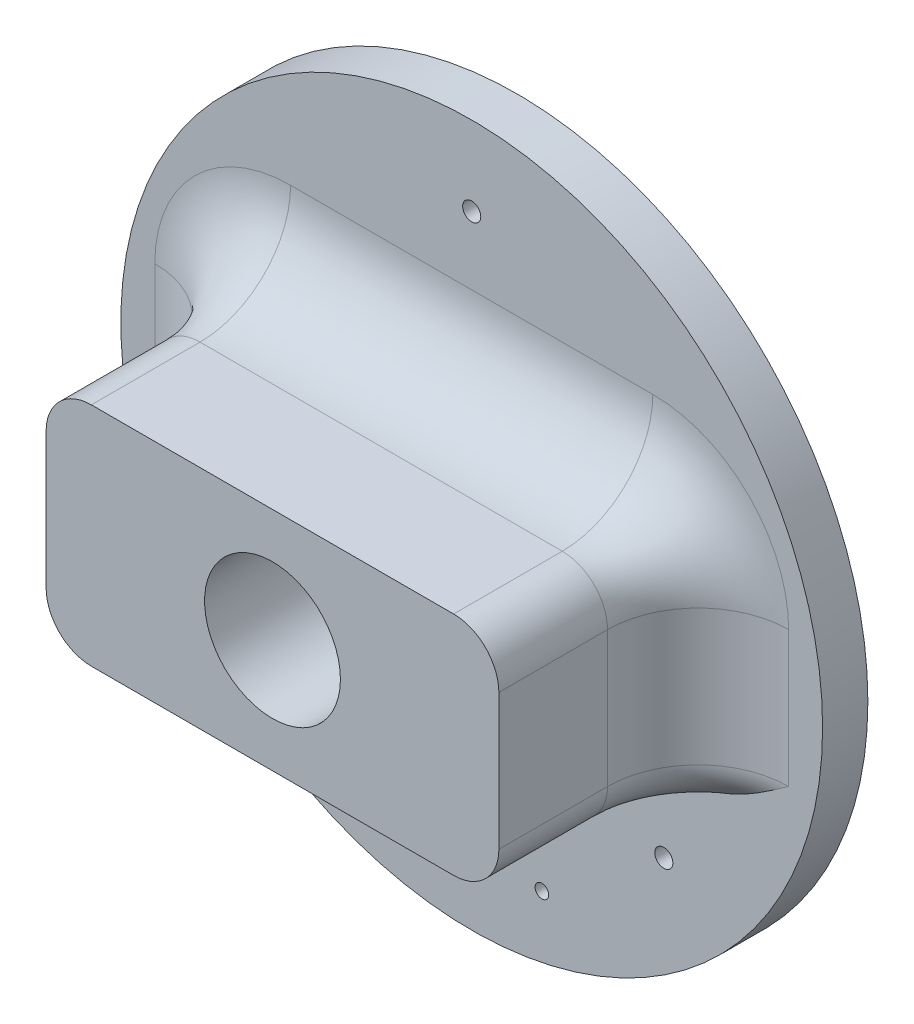
ISO-10303-21;
HEADER;
FILE_DESCRIPTION(('STEP AP214'),'2;1');
FILE_NAME('part.step','',(''),(''),'','','');
FILE_SCHEMA(('AUTOMOTIVE_DESIGN { 1 0 10303 214 1 1 1 1 }'));
ENDSEC;
DATA;
#1=APPLICATION_CONTEXT('core data for automotive mechanical design processes');
#2=APPLICATION_PROTOCOL_DEFINITION('international standard','automotive_design',2000,#1);
#3=PRODUCT_CONTEXT('',#1,'mechanical');
#4=PRODUCT('Part','Part','',(#3));
#5=PRODUCT_RELATED_PRODUCT_CATEGORY('part','',(#4));
#6=PRODUCT_DEFINITION_FORMATION('','',#4);
#7=PRODUCT_DEFINITION_CONTEXT('part definition',#1,'design');
#8=PRODUCT_DEFINITION('design','',#6,#7);
#9=PRODUCT_DEFINITION_SHAPE('','',#8);
#10=(LENGTH_UNIT() NAMED_UNIT(*) SI_UNIT(.MILLI.,.METRE.));
#11=(NAMED_UNIT(*) PLANE_ANGLE_UNIT() SI_UNIT($,.RADIAN.));
#12=(NAMED_UNIT(*) SI_UNIT($,.STERADIAN.) SOLID_ANGLE_UNIT());
#13=UNCERTAINTY_MEASURE_WITH_UNIT(LENGTH_MEASURE(1.E-05),#10,'distance_accuracy_value','');
#14=(GEOMETRIC_REPRESENTATION_CONTEXT(3) GLOBAL_UNCERTAINTY_ASSIGNED_CONTEXT((#13)) GLOBAL_UNIT_ASSIGNED_CONTEXT((#10,
#11,#12)) REPRESENTATION_CONTEXT('',''));
#15=CARTESIAN_POINT('',(0.,0.,0.));
#16=DIRECTION('',(0.,0.,1.));
#17=DIRECTION('',(1.,0.,0.));
#18=AXIS2_PLACEMENT_3D('',#15,#16,#17);
#19=CARTESIAN_POINT('',(0.,0.,10.));
#20=DIRECTION('',(0.,0.,1.));
#21=DIRECTION('',(1.,0.,0.));
#22=AXIS2_PLACEMENT_3D('',#19,#20,#21);
#23=PLANE('',#22);
#24=CARTESIAN_POINT('',(-42.4264068711926,-42.4264068711931,10.));
#25=DIRECTION('',(0.,0.,1.));
#26=DIRECTION('',(1.,0.,0.));
#27=AXIS2_PLACEMENT_3D('',#24,#25,#26);
#28=CIRCLE('',#27,2.);
#29=CARTESIAN_POINT('',(-40.4264068711926,-42.4264068711931,10.));
#30=VERTEX_POINT('',#29);
#31=EDGE_CURVE('E273',#30,#30,#28,.T.);
#32=ORIENTED_EDGE('',*,*,#31,.F.);
#33=EDGE_LOOP('',(#32));
#34=FACE_BOUND('',#33,.T.);
#35=CARTESIAN_POINT('',(15.4997806436091,-31.2502193563909,10.));
#36=DIRECTION('',(0.,0.,1.));
#37=DIRECTION('',(1.,0.,0.));
#38=AXIS2_PLACEMENT_3D('',#35,#36,#37);
#39=CIRCLE('',#38,1.5);
#40=CARTESIAN_POINT('',(16.9997806436091,-31.2502193563909,10.));
#41=VERTEX_POINT('',#40);
#42=EDGE_CURVE('E277',#41,#41,#39,.T.);
#43=ORIENTED_EDGE('',*,*,#42,.F.);
#44=EDGE_LOOP('',(#43));
#45=FACE_BOUND('',#44,.T.);
#46=CARTESIAN_POINT('',(15.4997806436092,-62.2497806436091,10.));
#47=DIRECTION('',(0.,0.,1.));
#48=DIRECTION('',(1.,0.,0.));
#49=AXIS2_PLACEMENT_3D('',#46,#47,#48);
#50=CIRCLE('',#49,1.5);
#51=CARTESIAN_POINT('',(16.9997806436092,-62.2497806436091,10.));
#52=VERTEX_POINT('',#51);
#53=EDGE_CURVE('E281',#52,#52,#50,.T.);
#54=ORIENTED_EDGE('',*,*,#53,.F.);
#55=EDGE_LOOP('',(#54));
#56=FACE_BOUND('',#55,.T.);
#57=CARTESIAN_POINT('',(-15.4997806436091,-62.2497806436091,10.));
#58=DIRECTION('',(0.,0.,1.));
#59=DIRECTION('',(1.,0.,0.));
#60=AXIS2_PLACEMENT_3D('',#57,#58,#59);
#61=CIRCLE('',#60,1.5);
#62=CARTESIAN_POINT('',(-13.9997806436091,-62.2497806436091,10.));
#63=VERTEX_POINT('',#62);
#64=EDGE_CURVE('E285',#63,#63,#61,.T.);
#65=ORIENTED_EDGE('',*,*,#64,.F.);
#66=EDGE_LOOP('',(#65));
#67=FACE_BOUND('',#66,.T.);
#68=CARTESIAN_POINT('',(0.,60.,10.));
#69=DIRECTION('',(0.,0.,1.));
#70=DIRECTION('',(1.,0.,0.));
#71=AXIS2_PLACEMENT_3D('',#68,#69,#70);
#72=CIRCLE('',#71,2.);
#73=CARTESIAN_POINT('',(1.99999999999995,60.,10.));
#74=VERTEX_POINT('',#73);
#75=EDGE_CURVE('E289',#74,#74,#72,.T.);
#76=ORIENTED_EDGE('',*,*,#75,.F.);
#77=EDGE_LOOP('',(#76));
#78=FACE_BOUND('',#77,.T.);
#79=CARTESIAN_POINT('',(42.4264068711927,-42.426406871193,10.));
#80=DIRECTION('',(0.,0.,1.));
#81=DIRECTION('',(1.,0.,0.));
#82=AXIS2_PLACEMENT_3D('',#79,#80,#81);
#83=CIRCLE('',#82,2.);
#84=CARTESIAN_POINT('',(44.4264068711927,-42.426406871193,10.));
#85=VERTEX_POINT('',#84);
#86=EDGE_CURVE('E293',#85,#85,#83,.T.);
#87=ORIENTED_EDGE('',*,*,#86,.F.);
#88=EDGE_LOOP('',(#87));
#89=FACE_BOUND('',#88,.T.);
#90=CARTESIAN_POINT('',(-15.4997806436092,-31.2502193563909,10.));
#91=DIRECTION('',(0.,0.,1.));
#92=DIRECTION('',(1.,0.,0.));
#93=AXIS2_PLACEMENT_3D('',#90,#91,#92);
#94=CIRCLE('',#93,1.50000000000003);
#95=CARTESIAN_POINT('',(-13.9997806436091,-31.2502193563909,10.));
#96=VERTEX_POINT('',#95);
#97=EDGE_CURVE('E297',#96,#96,#94,.T.);
#98=ORIENTED_EDGE('',*,*,#97,.F.);
#99=EDGE_LOOP('',(#98));
#100=FACE_BOUND('',#99,.T.);
#101=CARTESIAN_POINT('',(0.,0.,10.));
#102=DIRECTION('',(0.,0.,1.));
#103=DIRECTION('',(1.,0.,0.));
#104=AXIS2_PLACEMENT_3D('',#101,#102,#103);
#105=CIRCLE('',#104,77.5);
#106=CARTESIAN_POINT('',(77.5,0.,10.));
#107=VERTEX_POINT('',#106);
#108=EDGE_CURVE('E161',#107,#107,#105,.T.);
#109=ORIENTED_EDGE('',*,*,#108,.T.);
#110=EDGE_LOOP('',(#109));
#111=FACE_BOUND('',#110,.T.);
#112=CARTESIAN_POINT('',(-40.,15.,10.));
#113=DIRECTION('',(0.,0.,1.));
#114=DIRECTION('',(1.,0.,0.));
#115=AXIS2_PLACEMENT_3D('',#112,#113,#114);
#116=CIRCLE('',#115,30.);
#117=CARTESIAN_POINT('',(-40.,45.,10.));
#118=VERTEX_POINT('',#117);
#119=CARTESIAN_POINT('',(-70.,15.,10.));
#120=VERTEX_POINT('',#119);
#121=EDGE_CURVE('E45',#118,#120,#116,.T.);
#122=ORIENTED_EDGE('',*,*,#121,.F.);
#123=DIRECTION('',(-1.,0.,0.));
#124=VECTOR('',#123,1.);
#125=CARTESIAN_POINT('',(0.,45.,10.));
#126=LINE('',#125,#124);
#127=CARTESIAN_POINT('',(40.,45.,10.));
#128=VERTEX_POINT('',#127);
#129=EDGE_CURVE('E56',#118,#128,#126,.F.);
#130=ORIENTED_EDGE('',*,*,#129,.T.);
#131=CARTESIAN_POINT('',(40.,15.,10.));
#132=DIRECTION('',(0.,0.,1.));
#133=DIRECTION('',(1.,0.,0.));
#134=AXIS2_PLACEMENT_3D('',#131,#132,#133);
#135=CIRCLE('',#134,30.);
#136=CARTESIAN_POINT('',(70.,15.,10.));
#137=VERTEX_POINT('',#136);
#138=EDGE_CURVE('E132',#137,#128,#135,.T.);
#139=ORIENTED_EDGE('',*,*,#138,.F.);
#140=DIRECTION('',(0.,1.,0.));
#141=VECTOR('',#140,1.);
#142=CARTESIAN_POINT('',(70.,0.,10.));
#143=LINE('',#142,#141);
#144=CARTESIAN_POINT('',(70.,-15.,10.));
#145=VERTEX_POINT('',#144);
#146=EDGE_CURVE('E170',#137,#145,#143,.F.);
#147=ORIENTED_EDGE('',*,*,#146,.T.);
#148=CARTESIAN_POINT('',(47.6393202250021,-25.,10.));
#149=CARTESIAN_POINT('',(48.2331981965471,-24.9999673669586,10.));
#150=CARTESIAN_POINT('',(48.8264945480019,-24.970628009673,10.));
#151=CARTESIAN_POINT('',(50.0070536097781,-24.8595567923696,10.));
#152=CARTESIAN_POINT('',(50.5943259954527,-24.7779295660576,10.));
#153=CARTESIAN_POINT('',(51.750773053257,-24.5701777949689,10.));
#154=CARTESIAN_POINT('',(52.3200865115616,-24.4448074673556,10.));
#155=CARTESIAN_POINT('',(53.4487804276685,-24.1547169869959,10.));
#156=CARTESIAN_POINT('',(54.00815513936,-23.9899748187703,10.));
#157=CARTESIAN_POINT('',(55.7738877139314,-23.4100113970212,10.));
#158=CARTESIAN_POINT('',(56.9591729878578,-22.929774002456,10.));
#159=CARTESIAN_POINT('',(58.6951035109056,-22.1216962848325,10.));
#160=CARTESIAN_POINT('',(59.2672366240675,-21.8374253564783,10.));
#161=CARTESIAN_POINT('',(60.3987394378906,-21.2444542369346,10.));
#162=CARTESIAN_POINT('',(60.9581103395032,-20.9357563566905,10.));
#163=CARTESIAN_POINT('',(62.6288832158347,-19.9743938950044,10.));
#164=CARTESIAN_POINT('',(63.7227184872843,-19.2914070073752,10.));
#165=CARTESIAN_POINT('',(65.8784951602568,-17.8790655487652,9.99999999999999));
#166=CARTESIAN_POINT('',(66.9404507074271,-17.1497320042067,9.99999999999998));
#167=CARTESIAN_POINT('',(68.6580603080296,-15.9488306330498,10.));
#168=CARTESIAN_POINT('',(69.3174964157375,-15.482602173977,10.));
#169=CARTESIAN_POINT('',(69.9846039925874,-15.0108866216073,10.));
#170=CARTESIAN_POINT('',(69.9923019961747,-15.0054433110716,10.));
#171=CARTESIAN_POINT('',(70.,-15.,10.));
#172=B_SPLINE_CURVE_WITH_KNOTS('',3,(#148,#149,#150,#151,#152,#153,#154,#155,#156,#157,#158,
#159,#160,#161,#162,#163,#164,#165,#166,#167,#168,#169,#170,#171),.UNSPECIFIED.,.F.,.F.,(4,2,2,
2,2,2,2,2,2,2,2,4),(0.,1.78007201554144,3.55659299449519,5.30388464058156,7.05215561193782,
10.877932207877,12.7942256891187,14.7103380930205,18.5765462026327,22.4410126539084,
24.8638369819083,24.8921212531558),.UNSPECIFIED.);
#173=CARTESIAN_POINT('',(47.6393202250021,-25.,10.));
#174=VERTEX_POINT('',#173);
#175=EDGE_CURVE('E133',#145,#174,#172,.F.);
#176=ORIENTED_EDGE('',*,*,#175,.T.);
#177=DIRECTION('',(1.,0.,0.));
#178=VECTOR('',#177,1.);
#179=CARTESIAN_POINT('',(-50.,-25.,10.));
#180=LINE('',#179,#178);
#181=CARTESIAN_POINT('',(-47.6393202250021,-25.,10.));
#182=VERTEX_POINT('',#181);
#183=EDGE_CURVE('E139',#182,#174,#180,.T.);
#184=ORIENTED_EDGE('',*,*,#183,.F.);
#185=CARTESIAN_POINT('',(-47.6393202250021,-25.,10.));
#186=CARTESIAN_POINT('',(-48.2331981965471,-24.9999673669586,10.));
#187=CARTESIAN_POINT('',(-48.8264945480019,-24.970628009673,10.));
#188=CARTESIAN_POINT('',(-50.0070536097781,-24.8595567923696,10.));
#189=CARTESIAN_POINT('',(-50.5943259954527,-24.7779295660576,10.));
#190=CARTESIAN_POINT('',(-51.750773053257,-24.5701777949689,10.));
#191=CARTESIAN_POINT('',(-52.3200865115616,-24.4448074673556,10.));
#192=CARTESIAN_POINT('',(-53.4487804276685,-24.1547169869959,10.));
#193=CARTESIAN_POINT('',(-54.00815513936,-23.9899748187703,10.));
#194=CARTESIAN_POINT('',(-55.7738877139314,-23.4100113970212,10.));
#195=CARTESIAN_POINT('',(-56.9591729878578,-22.929774002456,10.));
#196=CARTESIAN_POINT('',(-58.6951035109056,-22.1216962848325,10.));
#197=CARTESIAN_POINT('',(-59.2672366240675,-21.8374253564783,10.));
#198=CARTESIAN_POINT('',(-60.3987394378906,-21.2444542369346,10.));
#199=CARTESIAN_POINT('',(-60.9581103395032,-20.9357563566905,10.));
#200=CARTESIAN_POINT('',(-62.6288832158347,-19.9743938950044,10.));
#201=CARTESIAN_POINT('',(-63.7227184872843,-19.2914070073752,10.));
#202=CARTESIAN_POINT('',(-65.8784951602568,-17.8790655487652,9.99999999999999));
#203=CARTESIAN_POINT('',(-66.9404507074271,-17.1497320042067,9.99999999999998));
#204=CARTESIAN_POINT('',(-68.6580603080296,-15.9488306330498,10.));
#205=CARTESIAN_POINT('',(-69.3174964157375,-15.482602173977,10.));
#206=CARTESIAN_POINT('',(-69.9846039925874,-15.0108866216073,10.));
#207=CARTESIAN_POINT('',(-69.9923019961747,-15.0054433110716,10.));
#208=CARTESIAN_POINT('',(-70.,-15.,10.));
#209=B_SPLINE_CURVE_WITH_KNOTS('',3,(#185,#186,#187,#188,#189,#190,#191,#192,#193,#194,#195,
#196,#197,#198,#199,#200,#201,#202,#203,#204,#205,#206,#207,#208),.UNSPECIFIED.,.F.,.F.,(4,2,2,
2,2,2,2,2,2,2,2,4),(0.,1.78007201554144,3.55659299449519,5.30388464058156,7.05215561193782,
10.877932207877,12.7942256891187,14.7103380930205,18.5765462026327,22.4410126539084,
24.8638369819083,24.8921212531558),.UNSPECIFIED.);
#210=CARTESIAN_POINT('',(-70.,-15.,10.));
#211=VERTEX_POINT('',#210);
#212=EDGE_CURVE('E124',#182,#211,#209,.T.);
#213=ORIENTED_EDGE('',*,*,#212,.T.);
#214=DIRECTION('',(0.,-1.,0.));
#215=VECTOR('',#214,1.);
#216=CARTESIAN_POINT('',(-70.,0.,10.));
#217=LINE('',#216,#215);
#218=EDGE_CURVE('E172',#211,#120,#217,.F.);
#219=ORIENTED_EDGE('',*,*,#218,.T.);
#220=EDGE_LOOP('',(#122,#130,#139,#147,#176,#184,#213,#219));
#221=FACE_BOUND('',#220,.T.);
#222=ADVANCED_FACE('F36',(#34,#45,#56,#67,#78,#89,#100,#111,#221),#23,.T.);
#223=CARTESIAN_POINT('',(0.,0.,10.));
#224=DIRECTION('',(0.,0.,-1.));
#225=DIRECTION('',(-1.,0.,0.));
#226=AXIS2_PLACEMENT_3D('',#223,#224,#225);
#227=CYLINDRICAL_SURFACE('',#226,77.5);
#228=ORIENTED_EDGE('',*,*,#108,.F.);
#229=EDGE_LOOP('',(#228));
#230=FACE_BOUND('',#229,.T.);
#231=CARTESIAN_POINT('',(0.,0.,0.));
#232=DIRECTION('',(0.,0.,1.));
#233=DIRECTION('',(1.,0.,0.));
#234=AXIS2_PLACEMENT_3D('',#231,#232,#233);
#235=CIRCLE('',#234,77.5);
#236=CARTESIAN_POINT('',(77.5,0.,0.));
#237=VERTEX_POINT('',#236);
#238=EDGE_CURVE('E165',#237,#237,#235,.T.);
#239=ORIENTED_EDGE('',*,*,#238,.T.);
#240=EDGE_LOOP('',(#239));
#241=FACE_BOUND('',#240,.T.);
#242=ADVANCED_FACE('F262',(#230,#241),#227,.T.);
#243=CARTESIAN_POINT('',(0.,0.,0.));
#244=DIRECTION('',(0.,0.,1.));
#245=DIRECTION('',(1.,0.,0.));
#246=AXIS2_PLACEMENT_3D('',#243,#244,#245);
#247=PLANE('',#246);
#248=CARTESIAN_POINT('',(-42.4264068711926,-42.4264068711931,0.));
#249=DIRECTION('',(0.,0.,1.));
#250=DIRECTION('',(1.,0.,0.));
#251=AXIS2_PLACEMENT_3D('',#248,#249,#250);
#252=CIRCLE('',#251,2.);
#253=CARTESIAN_POINT('',(-40.4264068711926,-42.4264068711931,0.));
#254=VERTEX_POINT('',#253);
#255=EDGE_CURVE('E432',#254,#254,#252,.T.);
#256=ORIENTED_EDGE('',*,*,#255,.T.);
#257=EDGE_LOOP('',(#256));
#258=FACE_BOUND('',#257,.T.);
#259=CARTESIAN_POINT('',(15.4997806436091,-31.2502193563909,0.));
#260=DIRECTION('',(0.,0.,1.));
#261=DIRECTION('',(1.,0.,0.));
#262=AXIS2_PLACEMENT_3D('',#259,#260,#261);
#263=CIRCLE('',#262,1.5);
#264=CARTESIAN_POINT('',(16.9997806436091,-31.2502193563909,0.));
#265=VERTEX_POINT('',#264);
#266=EDGE_CURVE('E435',#265,#265,#263,.T.);
#267=ORIENTED_EDGE('',*,*,#266,.T.);
#268=EDGE_LOOP('',(#267));
#269=FACE_BOUND('',#268,.T.);
#270=CARTESIAN_POINT('',(15.4997806436092,-62.2497806436091,0.));
#271=DIRECTION('',(0.,0.,1.));
#272=DIRECTION('',(1.,0.,0.));
#273=AXIS2_PLACEMENT_3D('',#270,#271,#272);
#274=CIRCLE('',#273,1.5);
#275=CARTESIAN_POINT('',(16.9997806436092,-62.2497806436091,0.));
#276=VERTEX_POINT('',#275);
#277=EDGE_CURVE('E438',#276,#276,#274,.T.);
#278=ORIENTED_EDGE('',*,*,#277,.T.);
#279=EDGE_LOOP('',(#278));
#280=FACE_BOUND('',#279,.T.);
#281=CARTESIAN_POINT('',(-15.4997806436091,-62.2497806436091,0.));
#282=DIRECTION('',(0.,0.,1.));
#283=DIRECTION('',(1.,0.,0.));
#284=AXIS2_PLACEMENT_3D('',#281,#282,#283);
#285=CIRCLE('',#284,1.5);
#286=CARTESIAN_POINT('',(-13.9997806436091,-62.2497806436091,0.));
#287=VERTEX_POINT('',#286);
#288=EDGE_CURVE('E430',#287,#287,#285,.T.);
#289=ORIENTED_EDGE('',*,*,#288,.T.);
#290=EDGE_LOOP('',(#289));
#291=FACE_BOUND('',#290,.T.);
#292=CARTESIAN_POINT('',(0.,60.,0.));
#293=DIRECTION('',(0.,0.,1.));
#294=DIRECTION('',(1.,0.,0.));
#295=AXIS2_PLACEMENT_3D('',#292,#293,#294);
#296=CIRCLE('',#295,2.);
#297=CARTESIAN_POINT('',(1.99999999999995,60.,0.));
#298=VERTEX_POINT('',#297);
#299=EDGE_CURVE('E424',#298,#298,#296,.T.);
#300=ORIENTED_EDGE('',*,*,#299,.T.);
#301=EDGE_LOOP('',(#300));
#302=FACE_BOUND('',#301,.T.);
#303=CARTESIAN_POINT('',(42.4264068711927,-42.426406871193,0.));
#304=DIRECTION('',(0.,0.,1.));
#305=DIRECTION('',(1.,0.,0.));
#306=AXIS2_PLACEMENT_3D('',#303,#304,#305);
#307=CIRCLE('',#306,2.);
#308=CARTESIAN_POINT('',(44.4264068711927,-42.426406871193,0.));
#309=VERTEX_POINT('',#308);
#310=EDGE_CURVE('E420',#309,#309,#307,.T.);
#311=ORIENTED_EDGE('',*,*,#310,.T.);
#312=EDGE_LOOP('',(#311));
#313=FACE_BOUND('',#312,.T.);
#314=CARTESIAN_POINT('',(-15.4997806436092,-31.2502193563909,0.));
#315=DIRECTION('',(0.,0.,1.));
#316=DIRECTION('',(1.,0.,0.));
#317=AXIS2_PLACEMENT_3D('',#314,#315,#316);
#318=CIRCLE('',#317,1.50000000000003);
#319=CARTESIAN_POINT('',(-13.9997806436091,-31.2502193563909,0.));
#320=VERTEX_POINT('',#319);
#321=EDGE_CURVE('E434',#320,#320,#318,.T.);
#322=ORIENTED_EDGE('',*,*,#321,.T.);
#323=EDGE_LOOP('',(#322));
#324=FACE_BOUND('',#323,.T.);
#325=ORIENTED_EDGE('',*,*,#238,.F.);
#326=EDGE_LOOP('',(#325));
#327=FACE_BOUND('',#326,.T.);
#328=ADVANCED_FACE('F267',(#258,#269,#280,#291,#302,#313,#324,#327),#247,.F.);
#329=CARTESIAN_POINT('',(50.,-25.,54.));
#330=DIRECTION('',(-1.,0.,0.));
#331=DIRECTION('',(0.,0.,1.));
#332=AXIS2_PLACEMENT_3D('',#329,#330,#331);
#333=PLANE('',#332);
#334=DIRECTION('',(0.,1.,0.));
#335=VECTOR('',#334,1.);
#336=CARTESIAN_POINT('',(50.,-25.,54.));
#337=LINE('',#336,#335);
#338=CARTESIAN_POINT('',(50.,-15.,54.));
#339=VERTEX_POINT('',#338);
#340=CARTESIAN_POINT('',(50.,15.,54.));
#341=VERTEX_POINT('',#340);
#342=EDGE_CURVE('E149',#339,#341,#337,.T.);
#343=ORIENTED_EDGE('',*,*,#342,.F.);
#344=DIRECTION('',(0.,0.,-1.));
#345=VECTOR('',#344,1.);
#346=CARTESIAN_POINT('',(50.,-15.,54.));
#347=LINE('',#346,#345);
#348=CARTESIAN_POINT('',(50.,-15.,30.));
#349=VERTEX_POINT('',#348);
#350=EDGE_CURVE('E194',#339,#349,#347,.T.);
#351=ORIENTED_EDGE('',*,*,#350,.T.);
#352=DIRECTION('',(0.,1.,0.));
#353=VECTOR('',#352,1.);
#354=CARTESIAN_POINT('',(50.,-25.,30.));
#355=LINE('',#354,#353);
#356=CARTESIAN_POINT('',(50.,15.,30.));
#357=VERTEX_POINT('',#356);
#358=EDGE_CURVE('E174',#349,#357,#355,.T.);
#359=ORIENTED_EDGE('',*,*,#358,.T.);
#360=DIRECTION('',(0.,0.,-1.));
#361=VECTOR('',#360,1.);
#362=CARTESIAN_POINT('',(50.,15.,54.));
#363=LINE('',#362,#361);
#364=EDGE_CURVE('E192',#357,#341,#363,.F.);
#365=ORIENTED_EDGE('',*,*,#364,.T.);
#366=EDGE_LOOP('',(#343,#351,#359,#365));
#367=FACE_BOUND('',#366,.T.);
#368=ADVANCED_FACE('F303',(#367),#333,.F.);
#369=CARTESIAN_POINT('',(-50.,25.,54.));
#370=DIRECTION('',(0.,-1.,0.));
#371=DIRECTION('',(0.,0.,-1.));
#372=AXIS2_PLACEMENT_3D('',#369,#370,#371);
#373=PLANE('',#372);
#374=DIRECTION('',(0.,0.,-1.));
#375=VECTOR('',#374,1.);
#376=CARTESIAN_POINT('',(40.,25.,54.));
#377=LINE('',#376,#375);
#378=CARTESIAN_POINT('',(40.,25.,54.));
#379=VERTEX_POINT('',#378);
#380=CARTESIAN_POINT('',(40.,25.,30.));
#381=VERTEX_POINT('',#380);
#382=EDGE_CURVE('E187',#379,#381,#377,.T.);
#383=ORIENTED_EDGE('',*,*,#382,.T.);
#384=DIRECTION('',(-1.,0.,0.));
#385=VECTOR('',#384,1.);
#386=CARTESIAN_POINT('',(-50.,25.,30.));
#387=LINE('',#386,#385);
#388=CARTESIAN_POINT('',(-40.,25.,30.));
#389=VERTEX_POINT('',#388);
#390=EDGE_CURVE('E11',#381,#389,#387,.T.);
#391=ORIENTED_EDGE('',*,*,#390,.T.);
#392=DIRECTION('',(0.,0.,-1.));
#393=VECTOR('',#392,1.);
#394=CARTESIAN_POINT('',(-40.,25.,54.));
#395=LINE('',#394,#393);
#396=CARTESIAN_POINT('',(-40.,25.,54.));
#397=VERTEX_POINT('',#396);
#398=EDGE_CURVE('E185',#389,#397,#395,.F.);
#399=ORIENTED_EDGE('',*,*,#398,.T.);
#400=DIRECTION('',(-1.,0.,0.));
#401=VECTOR('',#400,1.);
#402=CARTESIAN_POINT('',(-50.,25.,54.));
#403=LINE('',#402,#401);
#404=EDGE_CURVE('E153',#379,#397,#403,.T.);
#405=ORIENTED_EDGE('',*,*,#404,.F.);
#406=EDGE_LOOP('',(#383,#391,#399,#405));
#407=FACE_BOUND('',#406,.T.);
#408=ADVANCED_FACE('F308',(#407),#373,.F.);
#409=CARTESIAN_POINT('',(-50.,-25.,54.));
#410=DIRECTION('',(1.,0.,0.));
#411=DIRECTION('',(0.,0.,-1.));
#412=AXIS2_PLACEMENT_3D('',#409,#410,#411);
#413=PLANE('',#412);
#414=DIRECTION('',(0.,-1.,0.));
#415=VECTOR('',#414,1.);
#416=CARTESIAN_POINT('',(-50.,-25.,54.));
#417=LINE('',#416,#415);
#418=CARTESIAN_POINT('',(-50.,15.,54.));
#419=VERTEX_POINT('',#418);
#420=CARTESIAN_POINT('',(-50.,-15.,54.));
#421=VERTEX_POINT('',#420);
#422=EDGE_CURVE('E349',#419,#421,#417,.T.);
#423=ORIENTED_EDGE('',*,*,#422,.F.);
#424=DIRECTION('',(0.,0.,-1.));
#425=VECTOR('',#424,1.);
#426=CARTESIAN_POINT('',(-50.,15.,54.));
#427=LINE('',#426,#425);
#428=CARTESIAN_POINT('',(-50.,15.,30.));
#429=VERTEX_POINT('',#428);
#430=EDGE_CURVE('E206',#419,#429,#427,.T.);
#431=ORIENTED_EDGE('',*,*,#430,.T.);
#432=DIRECTION('',(0.,-1.,0.));
#433=VECTOR('',#432,1.);
#434=CARTESIAN_POINT('',(-50.,-25.,30.));
#435=LINE('',#434,#433);
#436=CARTESIAN_POINT('',(-50.,-15.,30.));
#437=VERTEX_POINT('',#436);
#438=EDGE_CURVE('E164',#429,#437,#435,.T.);
#439=ORIENTED_EDGE('',*,*,#438,.T.);
#440=DIRECTION('',(0.,0.,-1.));
#441=VECTOR('',#440,1.);
#442=CARTESIAN_POINT('',(-50.,-15.,54.));
#443=LINE('',#442,#441);
#444=EDGE_CURVE('E204',#437,#421,#443,.F.);
#445=ORIENTED_EDGE('',*,*,#444,.T.);
#446=EDGE_LOOP('',(#423,#431,#439,#445));
#447=FACE_BOUND('',#446,.T.);
#448=ADVANCED_FACE('F373',(#447),#413,.F.);
#449=CARTESIAN_POINT('',(-50.,-25.,54.));
#450=DIRECTION('',(0.,1.,0.));
#451=DIRECTION('',(0.,0.,1.));
#452=AXIS2_PLACEMENT_3D('',#449,#450,#451);
#453=PLANE('',#452);
#454=ORIENTED_EDGE('',*,*,#183,.T.);
#455=CARTESIAN_POINT('',(70.,-25.,30.));
#456=DIRECTION('',(0.,1.,0.));
#457=DIRECTION('',(0.,0.,1.));
#458=AXIS2_PLACEMENT_3D('',#455,#456,#457);
#459=CIRCLE('',#458,30.);
#460=CARTESIAN_POINT('',(40.,-25.,30.));
#461=VERTEX_POINT('',#460);
#462=EDGE_CURVE('E179',#174,#461,#459,.T.);
#463=ORIENTED_EDGE('',*,*,#462,.T.);
#464=DIRECTION('',(0.,0.,-1.));
#465=VECTOR('',#464,1.);
#466=CARTESIAN_POINT('',(40.,-25.,54.));
#467=LINE('',#466,#465);
#468=CARTESIAN_POINT('',(40.,-25.,54.));
#469=VERTEX_POINT('',#468);
#470=EDGE_CURVE('E145',#461,#469,#467,.F.);
#471=ORIENTED_EDGE('',*,*,#470,.T.);
#472=DIRECTION('',(1.,0.,0.));
#473=VECTOR('',#472,1.);
#474=CARTESIAN_POINT('',(-50.,-25.,54.));
#475=LINE('',#474,#473);
#476=CARTESIAN_POINT('',(-40.,-25.,54.));
#477=VERTEX_POINT('',#476);
#478=EDGE_CURVE('E159',#477,#469,#475,.T.);
#479=ORIENTED_EDGE('',*,*,#478,.F.);
#480=DIRECTION('',(0.,0.,-1.));
#481=VECTOR('',#480,1.);
#482=CARTESIAN_POINT('',(-40.,-25.,54.));
#483=LINE('',#482,#481);
#484=CARTESIAN_POINT('',(-40.,-25.,30.));
#485=VERTEX_POINT('',#484);
#486=EDGE_CURVE('E143',#477,#485,#483,.T.);
#487=ORIENTED_EDGE('',*,*,#486,.T.);
#488=CARTESIAN_POINT('',(-70.,-25.,30.));
#489=DIRECTION('',(0.,1.,0.));
#490=DIRECTION('',(0.,0.,1.));
#491=AXIS2_PLACEMENT_3D('',#488,#489,#490);
#492=CIRCLE('',#491,30.);
#493=EDGE_CURVE('E128',#485,#182,#492,.T.);
#494=ORIENTED_EDGE('',*,*,#493,.T.);
#495=EDGE_LOOP('',(#454,#463,#471,#479,#487,#494));
#496=FACE_BOUND('',#495,.T.);
#497=ADVANCED_FACE('F137',(#496),#453,.F.);
#498=CARTESIAN_POINT('',(0.,0.,54.));
#499=DIRECTION('',(0.,0.,-1.));
#500=DIRECTION('',(-1.,0.,0.));
#501=AXIS2_PLACEMENT_3D('',#498,#499,#500);
#502=PLANE('',#501);
#503=CARTESIAN_POINT('',(0.,0.,54.));
#504=DIRECTION('',(0.,0.,1.));
#505=DIRECTION('',(1.,0.,0.));
#506=AXIS2_PLACEMENT_3D('',#503,#504,#505);
#507=CIRCLE('',#506,15.);
#508=CARTESIAN_POINT('',(15.,0.,54.));
#509=VERTEX_POINT('',#508);
#510=EDGE_CURVE('E421',#509,#509,#507,.T.);
#511=ORIENTED_EDGE('',*,*,#510,.F.);
#512=EDGE_LOOP('',(#511));
#513=FACE_BOUND('',#512,.T.);
#514=ORIENTED_EDGE('',*,*,#478,.T.);
#515=CARTESIAN_POINT('',(40.,-15.,54.));
#516=DIRECTION('',(0.,0.,-1.));
#517=DIRECTION('',(-1.,0.,0.));
#518=AXIS2_PLACEMENT_3D('',#515,#516,#517);
#519=CIRCLE('',#518,10.);
#520=EDGE_CURVE('E202',#469,#339,#519,.F.);
#521=ORIENTED_EDGE('',*,*,#520,.T.);
#522=ORIENTED_EDGE('',*,*,#342,.T.);
#523=CARTESIAN_POINT('',(40.,15.,54.));
#524=DIRECTION('',(0.,0.,-1.));
#525=DIRECTION('',(-1.,0.,0.));
#526=AXIS2_PLACEMENT_3D('',#523,#524,#525);
#527=CIRCLE('',#526,10.);
#528=EDGE_CURVE('E200',#341,#379,#527,.F.);
#529=ORIENTED_EDGE('',*,*,#528,.T.);
#530=ORIENTED_EDGE('',*,*,#404,.T.);
#531=CARTESIAN_POINT('',(-40.,15.,54.));
#532=DIRECTION('',(0.,0.,-1.));
#533=DIRECTION('',(-1.,0.,0.));
#534=AXIS2_PLACEMENT_3D('',#531,#532,#533);
#535=CIRCLE('',#534,10.);
#536=EDGE_CURVE('E198',#397,#419,#535,.F.);
#537=ORIENTED_EDGE('',*,*,#536,.T.);
#538=ORIENTED_EDGE('',*,*,#422,.T.);
#539=CARTESIAN_POINT('',(-40.,-15.,54.));
#540=DIRECTION('',(0.,0.,-1.));
#541=DIRECTION('',(-1.,0.,0.));
#542=AXIS2_PLACEMENT_3D('',#539,#540,#541);
#543=CIRCLE('',#542,10.);
#544=EDGE_CURVE('E196',#421,#477,#543,.F.);
#545=ORIENTED_EDGE('',*,*,#544,.T.);
#546=EDGE_LOOP('',(#514,#521,#522,#529,#530,#537,#538,#545));
#547=FACE_BOUND('',#546,.T.);
#548=ADVANCED_FACE('F314',(#513,#547),#502,.F.);
#549=CARTESIAN_POINT('',(-70.,-25.,30.));
#550=DIRECTION('',(0.,-1.,0.));
#551=DIRECTION('',(0.,0.,-1.));
#552=AXIS2_PLACEMENT_3D('',#549,#550,#551);
#553=CYLINDRICAL_SURFACE('',#552,20.);
#554=ORIENTED_EDGE('',*,*,#438,.F.);
#555=CARTESIAN_POINT('',(-70.,15.,30.));
#556=DIRECTION('',(0.,-1.,0.));
#557=DIRECTION('',(0.,0.,-1.));
#558=AXIS2_PLACEMENT_3D('',#555,#556,#557);
#559=CIRCLE('',#558,20.);
#560=EDGE_CURVE('E190',#429,#120,#559,.F.);
#561=ORIENTED_EDGE('',*,*,#560,.T.);
#562=ORIENTED_EDGE('',*,*,#218,.F.);
#563=CARTESIAN_POINT('',(-70.,-15.,30.));
#564=DIRECTION('',(0.,1.,0.));
#565=DIRECTION('',(0.,0.,1.));
#566=AXIS2_PLACEMENT_3D('',#563,#564,#565);
#567=CIRCLE('',#566,20.);
#568=EDGE_CURVE('E129',#211,#437,#567,.F.);
#569=ORIENTED_EDGE('',*,*,#568,.T.);
#570=EDGE_LOOP('',(#554,#561,#562,#569));
#571=FACE_BOUND('',#570,.T.);
#572=ADVANCED_FACE('F312',(#571),#553,.F.);
#573=CARTESIAN_POINT('',(70.,-25.,30.));
#574=DIRECTION('',(0.,1.,0.));
#575=DIRECTION('',(0.,0.,1.));
#576=AXIS2_PLACEMENT_3D('',#573,#574,#575);
#577=CYLINDRICAL_SURFACE('',#576,20.);
#578=ORIENTED_EDGE('',*,*,#358,.F.);
#579=CARTESIAN_POINT('',(70.,-15.,30.));
#580=DIRECTION('',(0.,1.,0.));
#581=DIRECTION('',(0.,0.,1.));
#582=AXIS2_PLACEMENT_3D('',#579,#580,#581);
#583=CIRCLE('',#582,20.);
#584=EDGE_CURVE('E183',#349,#145,#583,.F.);
#585=ORIENTED_EDGE('',*,*,#584,.T.);
#586=ORIENTED_EDGE('',*,*,#146,.F.);
#587=CARTESIAN_POINT('',(70.,15.,30.));
#588=DIRECTION('',(0.,-1.,0.));
#589=DIRECTION('',(0.,0.,-1.));
#590=AXIS2_PLACEMENT_3D('',#587,#588,#589);
#591=CIRCLE('',#590,20.);
#592=EDGE_CURVE('E181',#137,#357,#591,.F.);
#593=ORIENTED_EDGE('',*,*,#592,.T.);
#594=EDGE_LOOP('',(#578,#585,#586,#593));
#595=FACE_BOUND('',#594,.T.);
#596=ADVANCED_FACE('F231',(#595),#577,.F.);
#597=CARTESIAN_POINT('',(40.,-15.,54.));
#598=DIRECTION('',(0.,0.,-1.));
#599=DIRECTION('',(-1.,0.,0.));
#600=AXIS2_PLACEMENT_3D('',#597,#598,#599);
#601=CYLINDRICAL_SURFACE('',#600,10.);
#602=ORIENTED_EDGE('',*,*,#520,.F.);
#603=ORIENTED_EDGE('',*,*,#470,.F.);
#604=CARTESIAN_POINT('',(40.,-15.,30.));
#605=DIRECTION('',(0.,0.,-1.));
#606=DIRECTION('',(-1.,0.,0.));
#607=AXIS2_PLACEMENT_3D('',#604,#605,#606);
#608=CIRCLE('',#607,10.);
#609=EDGE_CURVE('E150',#349,#461,#608,.T.);
#610=ORIENTED_EDGE('',*,*,#609,.F.);
#611=ORIENTED_EDGE('',*,*,#350,.F.);
#612=EDGE_LOOP('',(#602,#603,#610,#611));
#613=FACE_BOUND('',#612,.T.);
#614=ADVANCED_FACE('F229',(#613),#601,.T.);
#615=CARTESIAN_POINT('',(70.,-15.,30.));
#616=DIRECTION('',(0.,1.,0.));
#617=DIRECTION('',(0.,0.,1.));
#618=AXIS2_PLACEMENT_3D('',#615,#616,#617);
#619=TOROIDAL_SURFACE('',#618,30.,10.);
#620=ORIENTED_EDGE('',*,*,#175,.F.);
#621=ORIENTED_EDGE('',*,*,#584,.F.);
#622=ORIENTED_EDGE('',*,*,#609,.T.);
#623=ORIENTED_EDGE('',*,*,#462,.F.);
#624=EDGE_LOOP('',(#620,#621,#622,#623));
#625=FACE_BOUND('',#624,.T.);
#626=ADVANCED_FACE('F223',(#625),#619,.T.);
#627=CARTESIAN_POINT('',(40.,15.,54.));
#628=DIRECTION('',(0.,0.,-1.));
#629=DIRECTION('',(-1.,0.,0.));
#630=AXIS2_PLACEMENT_3D('',#627,#628,#629);
#631=CYLINDRICAL_SURFACE('',#630,10.);
#632=ORIENTED_EDGE('',*,*,#528,.F.);
#633=ORIENTED_EDGE('',*,*,#364,.F.);
#634=CARTESIAN_POINT('',(40.,15.,30.));
#635=DIRECTION('',(0.,0.,-1.));
#636=DIRECTION('',(-1.,0.,0.));
#637=AXIS2_PLACEMENT_3D('',#634,#635,#636);
#638=CIRCLE('',#637,10.);
#639=EDGE_CURVE('E155',#381,#357,#638,.T.);
#640=ORIENTED_EDGE('',*,*,#639,.F.);
#641=ORIENTED_EDGE('',*,*,#382,.F.);
#642=EDGE_LOOP('',(#632,#633,#640,#641));
#643=FACE_BOUND('',#642,.T.);
#644=ADVANCED_FACE('F228',(#643),#631,.T.);
#645=CARTESIAN_POINT('',(-40.,15.,54.));
#646=DIRECTION('',(0.,0.,-1.));
#647=DIRECTION('',(-1.,0.,0.));
#648=AXIS2_PLACEMENT_3D('',#645,#646,#647);
#649=CYLINDRICAL_SURFACE('',#648,10.);
#650=ORIENTED_EDGE('',*,*,#536,.F.);
#651=ORIENTED_EDGE('',*,*,#398,.F.);
#652=CARTESIAN_POINT('',(-40.,15.,30.));
#653=DIRECTION('',(0.,0.,-1.));
#654=DIRECTION('',(-1.,0.,0.));
#655=AXIS2_PLACEMENT_3D('',#652,#653,#654);
#656=CIRCLE('',#655,10.);
#657=EDGE_CURVE('E330',#429,#389,#656,.T.);
#658=ORIENTED_EDGE('',*,*,#657,.F.);
#659=ORIENTED_EDGE('',*,*,#430,.F.);
#660=EDGE_LOOP('',(#650,#651,#658,#659));
#661=FACE_BOUND('',#660,.T.);
#662=ADVANCED_FACE('F238',(#661),#649,.T.);
#663=CARTESIAN_POINT('',(-40.,-15.,54.));
#664=DIRECTION('',(0.,0.,-1.));
#665=DIRECTION('',(-1.,0.,0.));
#666=AXIS2_PLACEMENT_3D('',#663,#664,#665);
#667=CYLINDRICAL_SURFACE('',#666,10.);
#668=ORIENTED_EDGE('',*,*,#544,.F.);
#669=ORIENTED_EDGE('',*,*,#444,.F.);
#670=CARTESIAN_POINT('',(-40.,-15.,30.));
#671=DIRECTION('',(0.,0.,-1.));
#672=DIRECTION('',(-1.,0.,0.));
#673=AXIS2_PLACEMENT_3D('',#670,#671,#672);
#674=CIRCLE('',#673,10.);
#675=EDGE_CURVE('E334',#485,#437,#674,.T.);
#676=ORIENTED_EDGE('',*,*,#675,.F.);
#677=ORIENTED_EDGE('',*,*,#486,.F.);
#678=EDGE_LOOP('',(#668,#669,#676,#677));
#679=FACE_BOUND('',#678,.T.);
#680=ADVANCED_FACE('F241',(#679),#667,.T.);
#681=CARTESIAN_POINT('',(-70.,-15.,30.));
#682=DIRECTION('',(0.,1.,0.));
#683=DIRECTION('',(0.,0.,1.));
#684=AXIS2_PLACEMENT_3D('',#681,#682,#683);
#685=TOROIDAL_SURFACE('',#684,30.,10.);
#686=ORIENTED_EDGE('',*,*,#675,.T.);
#687=ORIENTED_EDGE('',*,*,#568,.F.);
#688=ORIENTED_EDGE('',*,*,#212,.F.);
#689=ORIENTED_EDGE('',*,*,#493,.F.);
#690=EDGE_LOOP('',(#686,#687,#688,#689));
#691=FACE_BOUND('',#690,.T.);
#692=ADVANCED_FACE('F127',(#691),#685,.T.);
#693=CARTESIAN_POINT('',(40.,15.,30.));
#694=DIRECTION('',(0.,0.,1.));
#695=DIRECTION('',(1.,0.,0.));
#696=AXIS2_PLACEMENT_3D('',#693,#694,#695);
#697=TOROIDAL_SURFACE('',#696,30.,20.);
#698=ORIENTED_EDGE('',*,*,#592,.F.);
#699=ORIENTED_EDGE('',*,*,#138,.T.);
#700=CARTESIAN_POINT('',(40.,45.,30.));
#701=DIRECTION('',(-1.,0.,0.));
#702=DIRECTION('',(0.,0.,1.));
#703=AXIS2_PLACEMENT_3D('',#700,#701,#702);
#704=CIRCLE('',#703,20.);
#705=EDGE_CURVE('E40',#381,#128,#704,.F.);
#706=ORIENTED_EDGE('',*,*,#705,.F.);
#707=ORIENTED_EDGE('',*,*,#639,.T.);
#708=EDGE_LOOP('',(#698,#699,#706,#707));
#709=FACE_BOUND('',#708,.T.);
#710=ADVANCED_FACE('F38',(#709),#697,.F.);
#711=CARTESIAN_POINT('',(-50.,45.,30.));
#712=DIRECTION('',(-1.,0.,0.));
#713=DIRECTION('',(0.,0.,1.));
#714=AXIS2_PLACEMENT_3D('',#711,#712,#713);
#715=CYLINDRICAL_SURFACE('',#714,20.);
#716=ORIENTED_EDGE('',*,*,#705,.T.);
#717=ORIENTED_EDGE('',*,*,#129,.F.);
#718=CARTESIAN_POINT('',(-40.,45.,30.));
#719=DIRECTION('',(1.,0.,0.));
#720=DIRECTION('',(0.,0.,-1.));
#721=AXIS2_PLACEMENT_3D('',#718,#719,#720);
#722=CIRCLE('',#721,20.);
#723=EDGE_CURVE('E342',#389,#118,#722,.T.);
#724=ORIENTED_EDGE('',*,*,#723,.F.);
#725=ORIENTED_EDGE('',*,*,#390,.F.);
#726=EDGE_LOOP('',(#716,#717,#724,#725));
#727=FACE_BOUND('',#726,.T.);
#728=ADVANCED_FACE('F252',(#727),#715,.F.);
#729=CARTESIAN_POINT('',(-40.,15.,30.));
#730=DIRECTION('',(0.,0.,1.));
#731=DIRECTION('',(1.,0.,0.));
#732=AXIS2_PLACEMENT_3D('',#729,#730,#731);
#733=TOROIDAL_SURFACE('',#732,30.,20.);
#734=ORIENTED_EDGE('',*,*,#657,.T.);
#735=ORIENTED_EDGE('',*,*,#723,.T.);
#736=ORIENTED_EDGE('',*,*,#121,.T.);
#737=ORIENTED_EDGE('',*,*,#560,.F.);
#738=EDGE_LOOP('',(#734,#735,#736,#737));
#739=FACE_BOUND('',#738,.T.);
#740=ADVANCED_FACE('F249',(#739),#733,.F.);
#741=CARTESIAN_POINT('',(-15.4997806436092,-31.2502193563909,0.));
#742=DIRECTION('',(0.,0.,1.));
#743=DIRECTION('',(1.,0.,0.));
#744=AXIS2_PLACEMENT_3D('',#741,#742,#743);
#745=CYLINDRICAL_SURFACE('',#744,1.50000000000003);
#746=ORIENTED_EDGE('',*,*,#97,.T.);
#747=EDGE_LOOP('',(#746));
#748=FACE_BOUND('',#747,.T.);
#749=ORIENTED_EDGE('',*,*,#321,.F.);
#750=EDGE_LOOP('',(#749));
#751=FACE_BOUND('',#750,.T.);
#752=ADVANCED_FACE('F251',(#748,#751),#745,.F.);
#753=CARTESIAN_POINT('',(42.4264068711927,-42.426406871193,0.));
#754=DIRECTION('',(0.,0.,1.));
#755=DIRECTION('',(1.,0.,0.));
#756=AXIS2_PLACEMENT_3D('',#753,#754,#755);
#757=CYLINDRICAL_SURFACE('',#756,2.);
#758=ORIENTED_EDGE('',*,*,#86,.T.);
#759=EDGE_LOOP('',(#758));
#760=FACE_BOUND('',#759,.T.);
#761=ORIENTED_EDGE('',*,*,#310,.F.);
#762=EDGE_LOOP('',(#761));
#763=FACE_BOUND('',#762,.T.);
#764=ADVANCED_FACE('F384',(#760,#763),#757,.F.);
#765=CARTESIAN_POINT('',(0.,60.,0.));
#766=DIRECTION('',(0.,0.,1.));
#767=DIRECTION('',(1.,0.,0.));
#768=AXIS2_PLACEMENT_3D('',#765,#766,#767);
#769=CYLINDRICAL_SURFACE('',#768,2.);
#770=ORIENTED_EDGE('',*,*,#75,.T.);
#771=EDGE_LOOP('',(#770));
#772=FACE_BOUND('',#771,.T.);
#773=ORIENTED_EDGE('',*,*,#299,.F.);
#774=EDGE_LOOP('',(#773));
#775=FACE_BOUND('',#774,.T.);
#776=ADVANCED_FACE('F390',(#772,#775),#769,.F.);
#777=CARTESIAN_POINT('',(-15.4997806436091,-62.2497806436091,0.));
#778=DIRECTION('',(0.,0.,1.));
#779=DIRECTION('',(1.,0.,0.));
#780=AXIS2_PLACEMENT_3D('',#777,#778,#779);
#781=CYLINDRICAL_SURFACE('',#780,1.5);
#782=ORIENTED_EDGE('',*,*,#64,.T.);
#783=EDGE_LOOP('',(#782));
#784=FACE_BOUND('',#783,.T.);
#785=ORIENTED_EDGE('',*,*,#288,.F.);
#786=EDGE_LOOP('',(#785));
#787=FACE_BOUND('',#786,.T.);
#788=ADVANCED_FACE('F386',(#784,#787),#781,.F.);
#789=CARTESIAN_POINT('',(15.4997806436092,-62.2497806436091,0.));
#790=DIRECTION('',(0.,0.,1.));
#791=DIRECTION('',(1.,0.,0.));
#792=AXIS2_PLACEMENT_3D('',#789,#790,#791);
#793=CYLINDRICAL_SURFACE('',#792,1.5);
#794=ORIENTED_EDGE('',*,*,#53,.T.);
#795=EDGE_LOOP('',(#794));
#796=FACE_BOUND('',#795,.T.);
#797=ORIENTED_EDGE('',*,*,#277,.F.);
#798=EDGE_LOOP('',(#797));
#799=FACE_BOUND('',#798,.T.);
#800=ADVANCED_FACE('F389',(#796,#799),#793,.F.);
#801=CARTESIAN_POINT('',(15.4997806436091,-31.2502193563909,0.));
#802=DIRECTION('',(0.,0.,1.));
#803=DIRECTION('',(1.,0.,0.));
#804=AXIS2_PLACEMENT_3D('',#801,#802,#803);
#805=CYLINDRICAL_SURFACE('',#804,1.5);
#806=ORIENTED_EDGE('',*,*,#42,.T.);
#807=EDGE_LOOP('',(#806));
#808=FACE_BOUND('',#807,.T.);
#809=ORIENTED_EDGE('',*,*,#266,.F.);
#810=EDGE_LOOP('',(#809));
#811=FACE_BOUND('',#810,.T.);
#812=ADVANCED_FACE('F394',(#808,#811),#805,.F.);
#813=CARTESIAN_POINT('',(-42.4264068711926,-42.4264068711931,0.));
#814=DIRECTION('',(0.,0.,1.));
#815=DIRECTION('',(1.,0.,0.));
#816=AXIS2_PLACEMENT_3D('',#813,#814,#815);
#817=CYLINDRICAL_SURFACE('',#816,2.);
#818=ORIENTED_EDGE('',*,*,#31,.T.);
#819=EDGE_LOOP('',(#818));
#820=FACE_BOUND('',#819,.T.);
#821=ORIENTED_EDGE('',*,*,#255,.F.);
#822=EDGE_LOOP('',(#821));
#823=FACE_BOUND('',#822,.T.);
#824=ADVANCED_FACE('F398',(#820,#823),#817,.F.);
#825=CARTESIAN_POINT('',(0.,0.,-32.4264068711929));
#826=DIRECTION('',(0.,0.,1.));
#827=DIRECTION('',(1.,0.,0.));
#828=AXIS2_PLACEMENT_3D('',#825,#826,#827);
#829=CYLINDRICAL_SURFACE('',#828,15.);
#830=CARTESIAN_POINT('',(0.,0.,10.));
#831=DIRECTION('',(0.,0.,1.));
#832=DIRECTION('',(1.,0.,0.));
#833=AXIS2_PLACEMENT_3D('',#830,#831,#832);
#834=CIRCLE('',#833,15.);
#835=CARTESIAN_POINT('',(15.,0.,10.));
#836=VERTEX_POINT('',#835);
#837=EDGE_CURVE('E419',#836,#836,#834,.F.);
#838=ORIENTED_EDGE('',*,*,#837,.T.);
#839=EDGE_LOOP('',(#838));
#840=FACE_BOUND('',#839,.T.);
#841=ORIENTED_EDGE('',*,*,#510,.T.);
#842=EDGE_LOOP('',(#841));
#843=FACE_BOUND('',#842,.T.);
#844=ADVANCED_FACE('F402',(#840,#843),#829,.F.);
#845=CARTESIAN_POINT('',(0.,0.,10.));
#846=DIRECTION('',(0.,0.,1.));
#847=DIRECTION('',(1.,0.,0.));
#848=AXIS2_PLACEMENT_3D('',#845,#846,#847);
#849=PLANE('',#848);
#850=ORIENTED_EDGE('',*,*,#837,.F.);
#851=EDGE_LOOP('',(#850));
#852=FACE_BOUND('',#851,.T.);
#853=ADVANCED_FACE('F411',(#852),#849,.T.);
#854=CLOSED_SHELL('',(#222,#242,#328,#368,#408,#448,#497,#548,#572,#596,#614,#626,#644,#662,
#680,#692,#710,#728,#740,#752,#764,#776,#788,#800,#812,#824,#844,#853));
#855=MANIFOLD_SOLID_BREP('B2',#854);
#856=ADVANCED_BREP_SHAPE_REPRESENTATION('',(#18,#855),#14);
#857=SHAPE_DEFINITION_REPRESENTATION(#9,#856);
ENDSEC;
END-ISO-10303-21;
